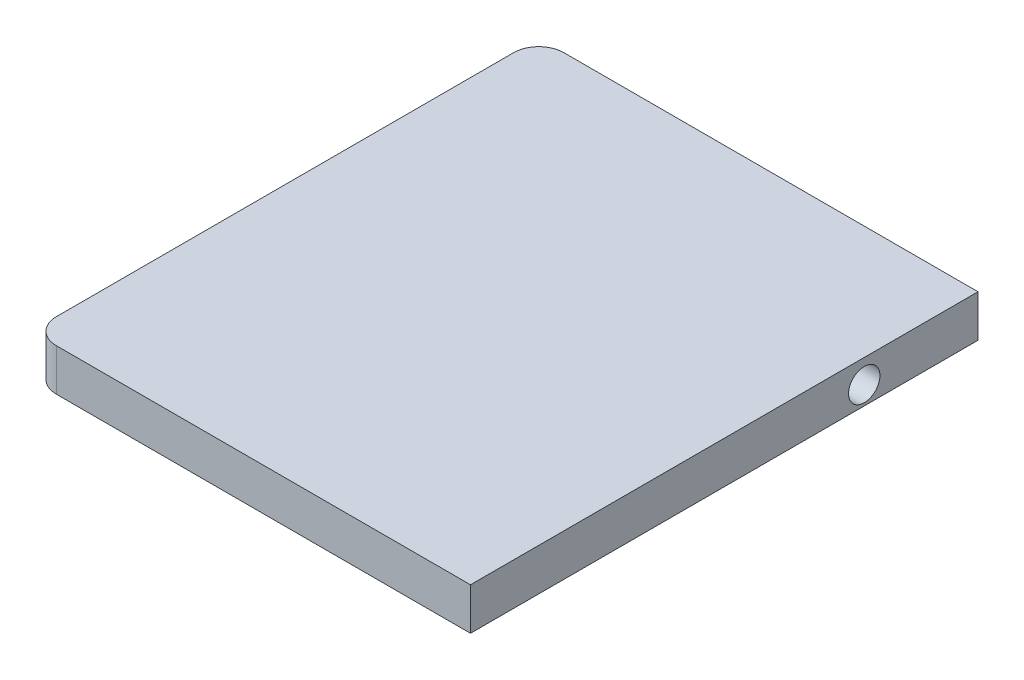
ISO-10303-21;
HEADER;
FILE_DESCRIPTION(('STEP AP214'),'2;1');
FILE_NAME('part.step','',(''),(''),'','','');
FILE_SCHEMA(('AUTOMOTIVE_DESIGN { 1 0 10303 214 1 1 1 1 }'));
ENDSEC;
DATA;
#1=APPLICATION_CONTEXT('core data for automotive mechanical design processes');
#2=APPLICATION_PROTOCOL_DEFINITION('international standard','automotive_design',2000,#1);
#3=PRODUCT_CONTEXT('',#1,'mechanical');
#4=PRODUCT('Part','Part','',(#3));
#5=PRODUCT_RELATED_PRODUCT_CATEGORY('part','',(#4));
#6=PRODUCT_DEFINITION_FORMATION('','',#4);
#7=PRODUCT_DEFINITION_CONTEXT('part definition',#1,'design');
#8=PRODUCT_DEFINITION('design','',#6,#7);
#9=PRODUCT_DEFINITION_SHAPE('','',#8);
#10=(LENGTH_UNIT() NAMED_UNIT(*) SI_UNIT(.MILLI.,.METRE.));
#11=(NAMED_UNIT(*) PLANE_ANGLE_UNIT() SI_UNIT($,.RADIAN.));
#12=(NAMED_UNIT(*) SI_UNIT($,.STERADIAN.) SOLID_ANGLE_UNIT());
#13=UNCERTAINTY_MEASURE_WITH_UNIT(LENGTH_MEASURE(1.E-05),#10,'distance_accuracy_value','');
#14=(GEOMETRIC_REPRESENTATION_CONTEXT(3) GLOBAL_UNCERTAINTY_ASSIGNED_CONTEXT((#13)) GLOBAL_UNIT_ASSIGNED_CONTEXT((#10,
#11,#12)) REPRESENTATION_CONTEXT('',''));
#15=CARTESIAN_POINT('',(0.,0.,0.));
#16=DIRECTION('',(0.,0.,1.));
#17=DIRECTION('',(1.,0.,0.));
#18=AXIS2_PLACEMENT_3D('',#15,#16,#17);
#19=CARTESIAN_POINT('',(-22.225,4.7625,25.6794));
#20=DIRECTION('',(1.,0.,0.));
#21=DIRECTION('',(0.,0.,-1.));
#22=AXIS2_PLACEMENT_3D('',#19,#20,#21);
#23=PLANE('',#22);
#24=DIRECTION('',(0.,-1.,0.));
#25=VECTOR('',#24,1.);
#26=CARTESIAN_POINT('',(-22.225,4.7625,-23.1394));
#27=LINE('',#26,#25);
#28=CARTESIAN_POINT('',(-22.225,4.7625,-23.1394));
#29=VERTEX_POINT('',#28);
#30=CARTESIAN_POINT('',(-22.225,0.507999999999995,-23.1394));
#31=VERTEX_POINT('',#30);
#32=EDGE_CURVE('E155',#29,#31,#27,.T.);
#33=ORIENTED_EDGE('',*,*,#32,.T.);
#34=DIRECTION('',(0.,0.,1.));
#35=VECTOR('',#34,1.);
#36=CARTESIAN_POINT('',(-22.225,0.507999999999995,25.6794));
#37=LINE('',#36,#35);
#38=CARTESIAN_POINT('',(-22.225,0.507999999999995,23.1394));
#39=VERTEX_POINT('',#38);
#40=EDGE_CURVE('E11',#31,#39,#37,.T.);
#41=ORIENTED_EDGE('',*,*,#40,.T.);
#42=DIRECTION('',(0.,-1.,0.));
#43=VECTOR('',#42,1.);
#44=CARTESIAN_POINT('',(-22.225,4.7625,23.1394));
#45=LINE('',#44,#43);
#46=CARTESIAN_POINT('',(-22.225,4.7625,23.1394));
#47=VERTEX_POINT('',#46);
#48=EDGE_CURVE('E138',#39,#47,#45,.F.);
#49=ORIENTED_EDGE('',*,*,#48,.T.);
#50=DIRECTION('',(0.,0.,1.));
#51=VECTOR('',#50,1.);
#52=CARTESIAN_POINT('',(-22.225,4.7625,25.6794));
#53=LINE('',#52,#51);
#54=EDGE_CURVE('E128',#29,#47,#53,.T.);
#55=ORIENTED_EDGE('',*,*,#54,.F.);
#56=EDGE_LOOP('',(#33,#41,#49,#55));
#57=FACE_BOUND('',#56,.T.);
#58=ADVANCED_FACE('F40',(#57),#23,.F.);
#59=CARTESIAN_POINT('',(22.225,4.7625,25.6794));
#60=DIRECTION('',(0.,0.,-1.));
#61=DIRECTION('',(-1.,0.,0.));
#62=AXIS2_PLACEMENT_3D('',#59,#60,#61);
#63=PLANE('',#62);
#64=DIRECTION('',(0.,-1.,0.));
#65=VECTOR('',#64,1.);
#66=CARTESIAN_POINT('',(-19.685,4.7625,25.6794));
#67=LINE('',#66,#65);
#68=CARTESIAN_POINT('',(-19.685,4.7625,25.6794));
#69=VERTEX_POINT('',#68);
#70=CARTESIAN_POINT('',(-19.685,0.507999999999995,25.6794));
#71=VERTEX_POINT('',#70);
#72=EDGE_CURVE('E166',#69,#71,#67,.T.);
#73=ORIENTED_EDGE('',*,*,#72,.T.);
#74=DIRECTION('',(1.,0.,0.));
#75=VECTOR('',#74,1.);
#76=CARTESIAN_POINT('',(22.225,0.507999999999995,25.6794));
#77=LINE('',#76,#75);
#78=CARTESIAN_POINT('',(22.225,0.507999999999996,25.6794));
#79=VERTEX_POINT('',#78);
#80=EDGE_CURVE('E134',#71,#79,#77,.T.);
#81=ORIENTED_EDGE('',*,*,#80,.T.);
#82=DIRECTION('',(0.,-1.,0.));
#83=VECTOR('',#82,1.);
#84=CARTESIAN_POINT('',(22.225,4.7625,25.6794));
#85=LINE('',#84,#83);
#86=CARTESIAN_POINT('',(22.225,4.7625,25.6794));
#87=VERTEX_POINT('',#86);
#88=EDGE_CURVE('E131',#87,#79,#85,.T.);
#89=ORIENTED_EDGE('',*,*,#88,.F.);
#90=DIRECTION('',(1.,0.,0.));
#91=VECTOR('',#90,1.);
#92=CARTESIAN_POINT('',(22.225,4.7625,25.6794));
#93=LINE('',#92,#91);
#94=EDGE_CURVE('E114',#69,#87,#93,.T.);
#95=ORIENTED_EDGE('',*,*,#94,.F.);
#96=EDGE_LOOP('',(#73,#81,#89,#95));
#97=FACE_BOUND('',#96,.T.);
#98=ADVANCED_FACE('F132',(#97),#63,.F.);
#99=CARTESIAN_POINT('',(22.225,4.7625,25.6794));
#100=DIRECTION('',(-1.,0.,0.));
#101=DIRECTION('',(0.,0.,1.));
#102=AXIS2_PLACEMENT_3D('',#99,#100,#101);
#103=PLANE('',#102);
#104=CARTESIAN_POINT('',(22.225,2.38125,-14.170025));
#105=DIRECTION('',(1.,0.,0.));
#106=DIRECTION('',(0.,0.,-1.));
#107=AXIS2_PLACEMENT_3D('',#104,#105,#106);
#108=CIRCLE('',#107,1.5875);
#109=CARTESIAN_POINT('',(22.225,2.38125,-15.757525));
#110=VERTEX_POINT('',#109);
#111=EDGE_CURVE('E223',#110,#110,#108,.T.);
#112=ORIENTED_EDGE('',*,*,#111,.F.);
#113=EDGE_LOOP('',(#112));
#114=FACE_BOUND('',#113,.T.);
#115=ORIENTED_EDGE('',*,*,#88,.T.);
#116=DIRECTION('',(0.,0.,-1.));
#117=VECTOR('',#116,1.);
#118=CARTESIAN_POINT('',(22.225,0.507999999999995,25.6794));
#119=LINE('',#118,#117);
#120=CARTESIAN_POINT('',(22.225,0.507999999999996,-25.6794));
#121=VERTEX_POINT('',#120);
#122=EDGE_CURVE('E194',#79,#121,#119,.T.);
#123=ORIENTED_EDGE('',*,*,#122,.T.);
#124=DIRECTION('',(0.,-1.,0.));
#125=VECTOR('',#124,1.);
#126=CARTESIAN_POINT('',(22.225,4.7625,-25.6794));
#127=LINE('',#126,#125);
#128=CARTESIAN_POINT('',(22.225,4.7625,-25.6794));
#129=VERTEX_POINT('',#128);
#130=EDGE_CURVE('E139',#129,#121,#127,.T.);
#131=ORIENTED_EDGE('',*,*,#130,.F.);
#132=DIRECTION('',(0.,0.,-1.));
#133=VECTOR('',#132,1.);
#134=CARTESIAN_POINT('',(22.225,4.7625,25.6794));
#135=LINE('',#134,#133);
#136=EDGE_CURVE('E119',#87,#129,#135,.T.);
#137=ORIENTED_EDGE('',*,*,#136,.F.);
#138=EDGE_LOOP('',(#115,#123,#131,#137));
#139=FACE_BOUND('',#138,.T.);
#140=ADVANCED_FACE('F141',(#114,#139),#103,.F.);
#141=CARTESIAN_POINT('',(22.225,4.7625,-25.6794));
#142=DIRECTION('',(0.,0.,1.));
#143=DIRECTION('',(1.,0.,0.));
#144=AXIS2_PLACEMENT_3D('',#141,#142,#143);
#145=PLANE('',#144);
#146=ORIENTED_EDGE('',*,*,#130,.T.);
#147=DIRECTION('',(-1.,0.,0.));
#148=VECTOR('',#147,1.);
#149=CARTESIAN_POINT('',(22.225,0.507999999999995,-25.6794));
#150=LINE('',#149,#148);
#151=CARTESIAN_POINT('',(-19.685,0.507999999999995,-25.6794));
#152=VERTEX_POINT('',#151);
#153=EDGE_CURVE('E66',#121,#152,#150,.T.);
#154=ORIENTED_EDGE('',*,*,#153,.T.);
#155=DIRECTION('',(0.,-1.,0.));
#156=VECTOR('',#155,1.);
#157=CARTESIAN_POINT('',(-19.685,4.7625,-25.6794));
#158=LINE('',#157,#156);
#159=CARTESIAN_POINT('',(-19.685,4.7625,-25.6794));
#160=VERTEX_POINT('',#159);
#161=EDGE_CURVE('E158',#152,#160,#158,.F.);
#162=ORIENTED_EDGE('',*,*,#161,.T.);
#163=DIRECTION('',(-1.,0.,0.));
#164=VECTOR('',#163,1.);
#165=CARTESIAN_POINT('',(22.225,4.7625,-25.6794));
#166=LINE('',#165,#164);
#167=EDGE_CURVE('E144',#129,#160,#166,.T.);
#168=ORIENTED_EDGE('',*,*,#167,.F.);
#169=EDGE_LOOP('',(#146,#154,#162,#168));
#170=FACE_BOUND('',#169,.T.);
#171=ADVANCED_FACE('F264',(#170),#145,.F.);
#172=CARTESIAN_POINT('',(0.,4.7625,0.));
#173=DIRECTION('',(0.,1.,0.));
#174=DIRECTION('',(0.,0.,1.));
#175=AXIS2_PLACEMENT_3D('',#172,#173,#174);
#176=PLANE('',#175);
#177=ORIENTED_EDGE('',*,*,#167,.T.);
#178=CARTESIAN_POINT('',(-19.685,4.7625,-23.1394));
#179=DIRECTION('',(0.,1.,0.));
#180=DIRECTION('',(0.,0.,1.));
#181=AXIS2_PLACEMENT_3D('',#178,#179,#180);
#182=CIRCLE('',#181,2.54);
#183=EDGE_CURVE('E163',#160,#29,#182,.T.);
#184=ORIENTED_EDGE('',*,*,#183,.T.);
#185=ORIENTED_EDGE('',*,*,#54,.T.);
#186=CARTESIAN_POINT('',(-19.685,4.7625,23.1394));
#187=DIRECTION('',(0.,1.,0.));
#188=DIRECTION('',(0.,0.,1.));
#189=AXIS2_PLACEMENT_3D('',#186,#187,#188);
#190=CIRCLE('',#189,2.54);
#191=EDGE_CURVE('E123',#47,#69,#190,.T.);
#192=ORIENTED_EDGE('',*,*,#191,.T.);
#193=ORIENTED_EDGE('',*,*,#94,.T.);
#194=ORIENTED_EDGE('',*,*,#136,.T.);
#195=EDGE_LOOP('',(#177,#184,#185,#192,#193,#194));
#196=FACE_BOUND('',#195,.T.);
#197=ADVANCED_FACE('F117',(#196),#176,.T.);
#198=CARTESIAN_POINT('',(0.,0.,0.));
#199=DIRECTION('',(0.,1.,0.));
#200=DIRECTION('',(0.,0.,1.));
#201=AXIS2_PLACEMENT_3D('',#198,#199,#200);
#202=PLANE('',#201);
#203=DIRECTION('',(-1.,0.,0.));
#204=VECTOR('',#203,1.);
#205=CARTESIAN_POINT('',(0.,0.,25.1714));
#206=LINE('',#205,#204);
#207=CARTESIAN_POINT('',(21.717,0.,25.1714));
#208=VERTEX_POINT('',#207);
#209=CARTESIAN_POINT('',(-19.685,0.,25.1714));
#210=VERTEX_POINT('',#209);
#211=EDGE_CURVE('E181',#208,#210,#206,.T.);
#212=ORIENTED_EDGE('',*,*,#211,.T.);
#213=CARTESIAN_POINT('',(-19.685,0.,23.1394));
#214=DIRECTION('',(0.,1.,0.));
#215=DIRECTION('',(0.,0.,1.));
#216=AXIS2_PLACEMENT_3D('',#213,#214,#215);
#217=CIRCLE('',#216,2.032);
#218=CARTESIAN_POINT('',(-21.717,0.,23.1394));
#219=VERTEX_POINT('',#218);
#220=EDGE_CURVE('E184',#210,#219,#217,.F.);
#221=ORIENTED_EDGE('',*,*,#220,.T.);
#222=DIRECTION('',(0.,0.,-1.));
#223=VECTOR('',#222,1.);
#224=CARTESIAN_POINT('',(-21.717,0.,0.));
#225=LINE('',#224,#223);
#226=CARTESIAN_POINT('',(-21.717,0.,-23.1394));
#227=VERTEX_POINT('',#226);
#228=EDGE_CURVE('E169',#219,#227,#225,.T.);
#229=ORIENTED_EDGE('',*,*,#228,.T.);
#230=CARTESIAN_POINT('',(-19.685,0.,-23.1394));
#231=DIRECTION('',(0.,1.,0.));
#232=DIRECTION('',(0.,0.,1.));
#233=AXIS2_PLACEMENT_3D('',#230,#231,#232);
#234=CIRCLE('',#233,2.032);
#235=CARTESIAN_POINT('',(-19.685,0.,-25.1714));
#236=VERTEX_POINT('',#235);
#237=EDGE_CURVE('E172',#227,#236,#234,.F.);
#238=ORIENTED_EDGE('',*,*,#237,.T.);
#239=DIRECTION('',(1.,0.,0.));
#240=VECTOR('',#239,1.);
#241=CARTESIAN_POINT('',(0.,0.,-25.1714));
#242=LINE('',#241,#240);
#243=CARTESIAN_POINT('',(21.717,0.,-25.1714));
#244=VERTEX_POINT('',#243);
#245=EDGE_CURVE('E175',#236,#244,#242,.T.);
#246=ORIENTED_EDGE('',*,*,#245,.T.);
#247=DIRECTION('',(0.,0.,1.));
#248=VECTOR('',#247,1.);
#249=CARTESIAN_POINT('',(21.717,0.,0.));
#250=LINE('',#249,#248);
#251=EDGE_CURVE('E178',#244,#208,#250,.T.);
#252=ORIENTED_EDGE('',*,*,#251,.T.);
#253=EDGE_LOOP('',(#212,#221,#229,#238,#246,#252));
#254=FACE_BOUND('',#253,.T.);
#255=ADVANCED_FACE('F258',(#254),#202,.F.);
#256=CARTESIAN_POINT('',(-7.71524999999999,2.38125,-14.170025));
#257=DIRECTION('',(1.,0.,0.));
#258=DIRECTION('',(0.,0.,-1.));
#259=AXIS2_PLACEMENT_3D('',#256,#257,#258);
#260=CYLINDRICAL_SURFACE('',#259,1.5875);
#261=CARTESIAN_POINT('',(-7.71524999999999,2.38125,-14.170025));
#262=DIRECTION('',(1.,0.,0.));
#263=DIRECTION('',(0.,0.,-1.));
#264=AXIS2_PLACEMENT_3D('',#261,#262,#263);
#265=CIRCLE('',#264,1.5875);
#266=CARTESIAN_POINT('',(-7.71524999999999,2.38125,-15.757525));
#267=VERTEX_POINT('',#266);
#268=EDGE_CURVE('E230',#267,#267,#265,.T.);
#269=ORIENTED_EDGE('',*,*,#268,.F.);
#270=EDGE_LOOP('',(#269));
#271=FACE_BOUND('',#270,.T.);
#272=ORIENTED_EDGE('',*,*,#111,.T.);
#273=EDGE_LOOP('',(#272));
#274=FACE_BOUND('',#273,.T.);
#275=ADVANCED_FACE('F376',(#271,#274),#260,.F.);
#276=CARTESIAN_POINT('',(-7.71524999999999,0.,0.));
#277=DIRECTION('',(1.,0.,0.));
#278=DIRECTION('',(0.,0.,-1.));
#279=AXIS2_PLACEMENT_3D('',#276,#277,#278);
#280=PLANE('',#279);
#281=ORIENTED_EDGE('',*,*,#268,.T.);
#282=EDGE_LOOP('',(#281));
#283=FACE_BOUND('',#282,.T.);
#284=ADVANCED_FACE('F287',(#283),#280,.T.);
#285=CARTESIAN_POINT('',(-19.685,4.7625,-23.1394));
#286=DIRECTION('',(0.,-1.,0.));
#287=DIRECTION('',(0.,0.,-1.));
#288=AXIS2_PLACEMENT_3D('',#285,#286,#287);
#289=CYLINDRICAL_SURFACE('',#288,2.54);
#290=ORIENTED_EDGE('',*,*,#161,.F.);
#291=CARTESIAN_POINT('',(-19.685,0.507999999999995,-23.1394));
#292=DIRECTION('',(0.,1.,0.));
#293=DIRECTION('',(0.,0.,1.));
#294=AXIS2_PLACEMENT_3D('',#291,#292,#293);
#295=CIRCLE('',#294,2.54);
#296=EDGE_CURVE('E51',#152,#31,#295,.T.);
#297=ORIENTED_EDGE('',*,*,#296,.T.);
#298=ORIENTED_EDGE('',*,*,#32,.F.);
#299=ORIENTED_EDGE('',*,*,#183,.F.);
#300=EDGE_LOOP('',(#290,#297,#298,#299));
#301=FACE_BOUND('',#300,.T.);
#302=ADVANCED_FACE('F284',(#301),#289,.T.);
#303=CARTESIAN_POINT('',(-19.685,4.7625,23.1394));
#304=DIRECTION('',(0.,-1.,0.));
#305=DIRECTION('',(0.,0.,-1.));
#306=AXIS2_PLACEMENT_3D('',#303,#304,#305);
#307=CYLINDRICAL_SURFACE('',#306,2.54);
#308=ORIENTED_EDGE('',*,*,#48,.F.);
#309=CARTESIAN_POINT('',(-19.685,0.507999999999995,23.1394));
#310=DIRECTION('',(0.,1.,0.));
#311=DIRECTION('',(0.,0.,1.));
#312=AXIS2_PLACEMENT_3D('',#309,#310,#311);
#313=CIRCLE('',#312,2.54);
#314=EDGE_CURVE('E188',#39,#71,#313,.T.);
#315=ORIENTED_EDGE('',*,*,#314,.T.);
#316=ORIENTED_EDGE('',*,*,#72,.F.);
#317=ORIENTED_EDGE('',*,*,#191,.F.);
#318=EDGE_LOOP('',(#308,#315,#316,#317));
#319=FACE_BOUND('',#318,.T.);
#320=ADVANCED_FACE('F245',(#319),#307,.T.);
#321=CARTESIAN_POINT('',(22.225,0.507999999999995,-25.6794));
#322=DIRECTION('',(0.,0.707106781186554,0.707106781186542));
#323=DIRECTION('',(-1.,0.,0.));
#324=AXIS2_PLACEMENT_3D('',#321,#322,#323);
#325=PLANE('',#324);
#326=DIRECTION('',(0.,-0.707106781186543,0.707106781186552));
#327=VECTOR('',#326,1.);
#328=CARTESIAN_POINT('',(-19.685,0.507999999999995,-25.6794));
#329=LINE('',#328,#327);
#330=EDGE_CURVE('E214',#152,#236,#329,.T.);
#331=ORIENTED_EDGE('',*,*,#330,.F.);
#332=ORIENTED_EDGE('',*,*,#153,.F.);
#333=DIRECTION('',(-0.577350269189628,-0.57735026918962,0.57735026918963));
#334=VECTOR('',#333,1.);
#335=CARTESIAN_POINT('',(22.225,0.507999999999995,-25.6794));
#336=LINE('',#335,#334);
#337=EDGE_CURVE('E45',#244,#121,#336,.F.);
#338=ORIENTED_EDGE('',*,*,#337,.F.);
#339=ORIENTED_EDGE('',*,*,#245,.F.);
#340=EDGE_LOOP('',(#331,#332,#338,#339));
#341=FACE_BOUND('',#340,.T.);
#342=ADVANCED_FACE('F43',(#341),#325,.F.);
#343=CARTESIAN_POINT('',(22.225,0.507999999999995,25.6794));
#344=DIRECTION('',(-0.707106781186543,0.707106781186552,0.));
#345=DIRECTION('',(0.,0.,-1.));
#346=AXIS2_PLACEMENT_3D('',#343,#344,#345);
#347=PLANE('',#346);
#348=ORIENTED_EDGE('',*,*,#337,.T.);
#349=ORIENTED_EDGE('',*,*,#122,.F.);
#350=DIRECTION('',(-0.577350269189628,-0.577350269189621,-0.577350269189628));
#351=VECTOR('',#350,1.);
#352=CARTESIAN_POINT('',(22.225,0.507999999999995,25.6794));
#353=LINE('',#352,#351);
#354=EDGE_CURVE('E211',#208,#79,#353,.F.);
#355=ORIENTED_EDGE('',*,*,#354,.F.);
#356=ORIENTED_EDGE('',*,*,#251,.F.);
#357=EDGE_LOOP('',(#348,#349,#355,#356));
#358=FACE_BOUND('',#357,.T.);
#359=ADVANCED_FACE('F263',(#358),#347,.F.);
#360=CARTESIAN_POINT('',(-19.685,0.,-23.1394));
#361=DIRECTION('',(0.,1.,0.));
#362=DIRECTION('',(0.,0.,1.));
#363=AXIS2_PLACEMENT_3D('',#360,#361,#362);
#364=CONICAL_SURFACE('',#363,2.032,0.785398163397455);
#365=ORIENTED_EDGE('',*,*,#330,.T.);
#366=ORIENTED_EDGE('',*,*,#237,.F.);
#367=DIRECTION('',(0.707106781186552,-0.707106781186543,0.));
#368=VECTOR('',#367,1.);
#369=CARTESIAN_POINT('',(-22.225,0.507999999999995,-23.1394));
#370=LINE('',#369,#368);
#371=EDGE_CURVE('E207',#31,#227,#370,.T.);
#372=ORIENTED_EDGE('',*,*,#371,.F.);
#373=ORIENTED_EDGE('',*,*,#296,.F.);
#374=EDGE_LOOP('',(#365,#366,#372,#373));
#375=FACE_BOUND('',#374,.T.);
#376=ADVANCED_FACE('F267',(#375),#364,.T.);
#377=CARTESIAN_POINT('',(22.225,0.507999999999995,25.6794));
#378=DIRECTION('',(0.,0.707106781186552,-0.707106781186543));
#379=DIRECTION('',(1.,0.,0.));
#380=AXIS2_PLACEMENT_3D('',#377,#378,#379);
#381=PLANE('',#380);
#382=ORIENTED_EDGE('',*,*,#354,.T.);
#383=ORIENTED_EDGE('',*,*,#80,.F.);
#384=DIRECTION('',(0.,0.707106781186543,0.707106781186552));
#385=VECTOR('',#384,1.);
#386=CARTESIAN_POINT('',(-19.685,0.,25.1714));
#387=LINE('',#386,#385);
#388=EDGE_CURVE('E204',#210,#71,#387,.T.);
#389=ORIENTED_EDGE('',*,*,#388,.F.);
#390=ORIENTED_EDGE('',*,*,#211,.F.);
#391=EDGE_LOOP('',(#382,#383,#389,#390));
#392=FACE_BOUND('',#391,.T.);
#393=ADVANCED_FACE('F262',(#392),#381,.F.);
#394=CARTESIAN_POINT('',(-22.225,0.507999999999995,25.6794));
#395=DIRECTION('',(0.707106781186543,0.707106781186552,0.));
#396=DIRECTION('',(0.,0.,1.));
#397=AXIS2_PLACEMENT_3D('',#394,#395,#396);
#398=PLANE('',#397);
#399=ORIENTED_EDGE('',*,*,#371,.T.);
#400=ORIENTED_EDGE('',*,*,#228,.F.);
#401=DIRECTION('',(0.707106781186552,-0.707106781186543,0.));
#402=VECTOR('',#401,1.);
#403=CARTESIAN_POINT('',(-22.225,0.507999999999995,23.1394));
#404=LINE('',#403,#402);
#405=EDGE_CURVE('E201',#39,#219,#404,.T.);
#406=ORIENTED_EDGE('',*,*,#405,.F.);
#407=ORIENTED_EDGE('',*,*,#40,.F.);
#408=EDGE_LOOP('',(#399,#400,#406,#407));
#409=FACE_BOUND('',#408,.T.);
#410=ADVANCED_FACE('F255',(#409),#398,.F.);
#411=CARTESIAN_POINT('',(-19.685,0.,23.1394));
#412=DIRECTION('',(0.,1.,0.));
#413=DIRECTION('',(0.,0.,1.));
#414=AXIS2_PLACEMENT_3D('',#411,#412,#413);
#415=CONICAL_SURFACE('',#414,2.032,0.785398163397455);
#416=ORIENTED_EDGE('',*,*,#388,.T.);
#417=ORIENTED_EDGE('',*,*,#314,.F.);
#418=ORIENTED_EDGE('',*,*,#405,.T.);
#419=ORIENTED_EDGE('',*,*,#220,.F.);
#420=EDGE_LOOP('',(#416,#417,#418,#419));
#421=FACE_BOUND('',#420,.T.);
#422=ADVANCED_FACE('F249',(#421),#415,.T.);
#423=CLOSED_SHELL('',(#58,#98,#140,#171,#197,#255,#275,#284,#302,#320,#342,#359,#376,#393,#410,#422));
#424=MANIFOLD_SOLID_BREP('B2',#423);
#425=ADVANCED_BREP_SHAPE_REPRESENTATION('',(#18,#424),#14);
#426=SHAPE_DEFINITION_REPRESENTATION(#9,#425);
ENDSEC;
END-ISO-10303-21;
